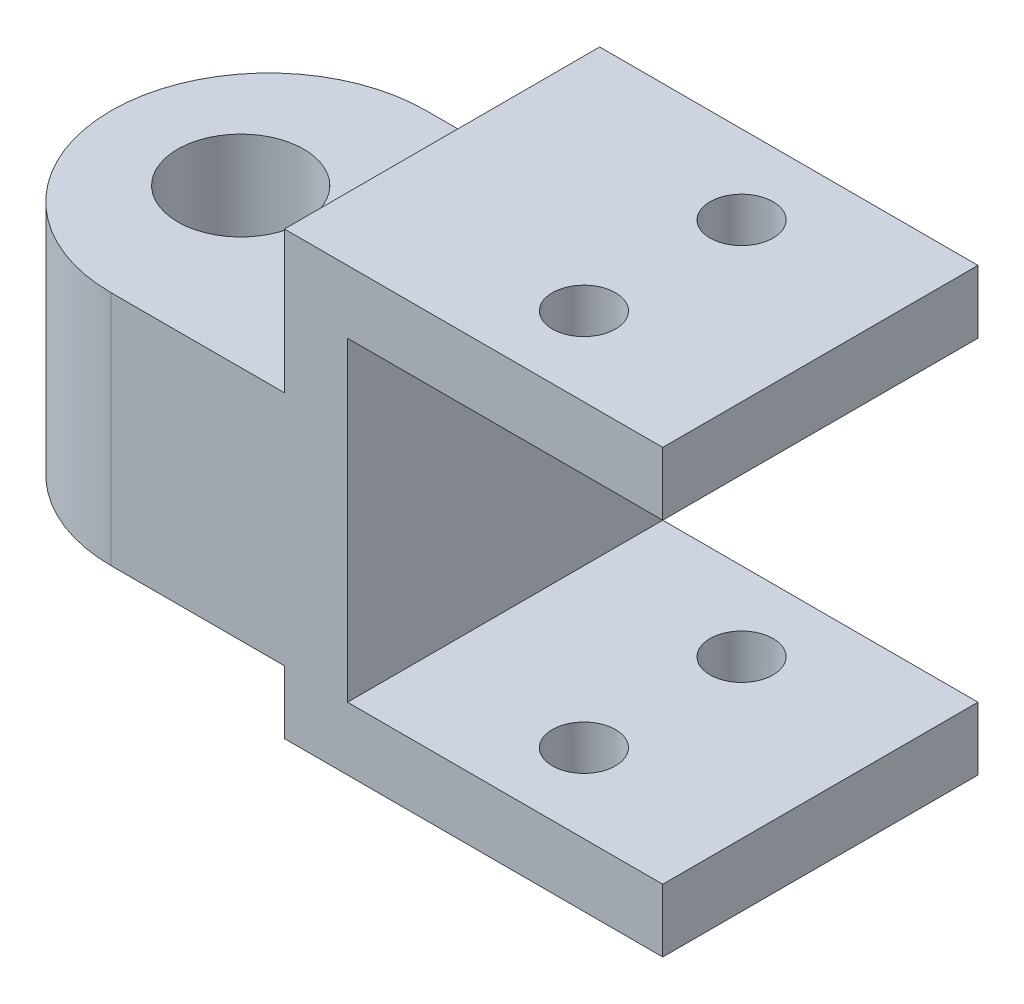
ISO-10303-21;
HEADER;
FILE_DESCRIPTION(('STEP AP214'),'2;1');
FILE_NAME('part.step','',(''),(''),'','','');
FILE_SCHEMA(('AUTOMOTIVE_DESIGN { 1 0 10303 214 1 1 1 1 }'));
ENDSEC;
DATA;
#1=APPLICATION_CONTEXT('core data for automotive mechanical design processes');
#2=APPLICATION_PROTOCOL_DEFINITION('international standard','automotive_design',2000,#1);
#3=PRODUCT_CONTEXT('',#1,'mechanical');
#4=PRODUCT('Part','Part','',(#3));
#5=PRODUCT_RELATED_PRODUCT_CATEGORY('part','',(#4));
#6=PRODUCT_DEFINITION_FORMATION('','',#4);
#7=PRODUCT_DEFINITION_CONTEXT('part definition',#1,'design');
#8=PRODUCT_DEFINITION('design','',#6,#7);
#9=PRODUCT_DEFINITION_SHAPE('','',#8);
#10=(LENGTH_UNIT() NAMED_UNIT(*) SI_UNIT(.MILLI.,.METRE.));
#11=(NAMED_UNIT(*) PLANE_ANGLE_UNIT() SI_UNIT($,.RADIAN.));
#12=(NAMED_UNIT(*) SI_UNIT($,.STERADIAN.) SOLID_ANGLE_UNIT());
#13=UNCERTAINTY_MEASURE_WITH_UNIT(LENGTH_MEASURE(1.E-05),#10,'distance_accuracy_value','');
#14=(GEOMETRIC_REPRESENTATION_CONTEXT(3) GLOBAL_UNCERTAINTY_ASSIGNED_CONTEXT((#13)) GLOBAL_UNIT_ASSIGNED_CONTEXT((#10,
#11,#12)) REPRESENTATION_CONTEXT('',''));
#15=CARTESIAN_POINT('',(0.,0.,0.));
#16=DIRECTION('',(0.,0.,1.));
#17=DIRECTION('',(1.,0.,0.));
#18=AXIS2_PLACEMENT_3D('',#15,#16,#17);
#19=CARTESIAN_POINT('',(-10.,0.,20.));
#20=DIRECTION('',(1.,0.,0.));
#21=DIRECTION('',(0.,0.,-1.));
#22=AXIS2_PLACEMENT_3D('',#19,#20,#21);
#23=PLANE('',#22);
#24=DIRECTION('',(0.,-1.,0.));
#25=VECTOR('',#24,1.);
#26=CARTESIAN_POINT('',(-10.,0.,0.));
#27=LINE('',#26,#25);
#28=CARTESIAN_POINT('',(-10.,10.,0.));
#29=VERTEX_POINT('',#28);
#30=CARTESIAN_POINT('',(-10.,-10.,0.));
#31=VERTEX_POINT('',#30);
#32=EDGE_CURVE('E131',#29,#31,#27,.T.);
#33=ORIENTED_EDGE('',*,*,#32,.F.);
#34=DIRECTION('',(0.,0.,-1.));
#35=VECTOR('',#34,1.);
#36=CARTESIAN_POINT('',(-10.,10.,20.));
#37=LINE('',#36,#35);
#38=CARTESIAN_POINT('',(-10.,10.,20.));
#39=VERTEX_POINT('',#38);
#40=EDGE_CURVE('E126',#39,#29,#37,.T.);
#41=ORIENTED_EDGE('',*,*,#40,.F.);
#42=DIRECTION('',(0.,-1.,0.));
#43=VECTOR('',#42,1.);
#44=CARTESIAN_POINT('',(-10.,0.,20.));
#45=LINE('',#44,#43);
#46=CARTESIAN_POINT('',(-10.,-10.,20.));
#47=VERTEX_POINT('',#46);
#48=EDGE_CURVE('E128',#39,#47,#45,.T.);
#49=ORIENTED_EDGE('',*,*,#48,.T.);
#50=DIRECTION('',(0.,0.,-1.));
#51=VECTOR('',#50,1.);
#52=CARTESIAN_POINT('',(-10.,-10.,20.));
#53=LINE('',#52,#51);
#54=EDGE_CURVE('E172',#47,#31,#53,.T.);
#55=ORIENTED_EDGE('',*,*,#54,.T.);
#56=EDGE_LOOP('',(#33,#41,#49,#55));
#57=FACE_BOUND('',#56,.T.);
#58=ADVANCED_FACE('F34',(#57),#23,.T.);
#59=CARTESIAN_POINT('',(0.,10.,20.));
#60=DIRECTION('',(0.,-1.,0.));
#61=DIRECTION('',(1.,0.,0.));
#62=AXIS2_PLACEMENT_3D('',#59,#60,#61);
#63=PLANE('',#62);
#64=CARTESIAN_POINT('',(0.,10.,5.));
#65=DIRECTION('',(0.,-1.,0.));
#66=DIRECTION('',(1.,0.,0.));
#67=AXIS2_PLACEMENT_3D('',#64,#65,#66);
#68=CIRCLE('',#67,2.);
#69=CARTESIAN_POINT('',(2.,10.,5.));
#70=VERTEX_POINT('',#69);
#71=EDGE_CURVE('E230',#70,#70,#68,.T.);
#72=ORIENTED_EDGE('',*,*,#71,.F.);
#73=EDGE_LOOP('',(#72));
#74=FACE_BOUND('',#73,.T.);
#75=CARTESIAN_POINT('',(0.,10.,15.));
#76=DIRECTION('',(0.,-1.,0.));
#77=DIRECTION('',(1.,0.,0.));
#78=AXIS2_PLACEMENT_3D('',#75,#76,#77);
#79=CIRCLE('',#78,2.);
#80=CARTESIAN_POINT('',(2.,10.,15.));
#81=VERTEX_POINT('',#80);
#82=EDGE_CURVE('E225',#81,#81,#79,.T.);
#83=ORIENTED_EDGE('',*,*,#82,.F.);
#84=EDGE_LOOP('',(#83));
#85=FACE_BOUND('',#84,.T.);
#86=DIRECTION('',(-1.,0.,0.));
#87=VECTOR('',#86,1.);
#88=CARTESIAN_POINT('',(0.,10.,0.));
#89=LINE('',#88,#87);
#90=CARTESIAN_POINT('',(10.,10.,0.));
#91=VERTEX_POINT('',#90);
#92=EDGE_CURVE('E174',#91,#29,#89,.T.);
#93=ORIENTED_EDGE('',*,*,#92,.F.);
#94=DIRECTION('',(0.,0.,-1.));
#95=VECTOR('',#94,1.);
#96=CARTESIAN_POINT('',(10.,10.,20.));
#97=LINE('',#96,#95);
#98=CARTESIAN_POINT('',(10.,10.,20.));
#99=VERTEX_POINT('',#98);
#100=EDGE_CURVE('E137',#99,#91,#97,.T.);
#101=ORIENTED_EDGE('',*,*,#100,.F.);
#102=DIRECTION('',(-1.,0.,0.));
#103=VECTOR('',#102,1.);
#104=CARTESIAN_POINT('',(0.,10.,20.));
#105=LINE('',#104,#103);
#106=EDGE_CURVE('E142',#99,#39,#105,.T.);
#107=ORIENTED_EDGE('',*,*,#106,.T.);
#108=ORIENTED_EDGE('',*,*,#40,.T.);
#109=EDGE_LOOP('',(#93,#101,#107,#108));
#110=FACE_BOUND('',#109,.T.);
#111=ADVANCED_FACE('F148',(#74,#85,#110),#63,.T.);
#112=CARTESIAN_POINT('',(10.,0.,20.));
#113=DIRECTION('',(-1.,0.,0.));
#114=DIRECTION('',(0.,0.,1.));
#115=AXIS2_PLACEMENT_3D('',#112,#113,#114);
#116=PLANE('',#115);
#117=DIRECTION('',(0.,1.,0.));
#118=VECTOR('',#117,1.);
#119=CARTESIAN_POINT('',(10.,0.,0.));
#120=LINE('',#119,#118);
#121=CARTESIAN_POINT('',(10.,14.,0.));
#122=VERTEX_POINT('',#121);
#123=EDGE_CURVE('E177',#91,#122,#120,.T.);
#124=ORIENTED_EDGE('',*,*,#123,.T.);
#125=DIRECTION('',(0.,0.,-1.));
#126=VECTOR('',#125,1.);
#127=CARTESIAN_POINT('',(10.,14.,20.));
#128=LINE('',#127,#126);
#129=CARTESIAN_POINT('',(10.,14.,20.));
#130=VERTEX_POINT('',#129);
#131=EDGE_CURVE('E215',#130,#122,#128,.T.);
#132=ORIENTED_EDGE('',*,*,#131,.F.);
#133=DIRECTION('',(0.,1.,0.));
#134=VECTOR('',#133,1.);
#135=CARTESIAN_POINT('',(10.,0.,20.));
#136=LINE('',#135,#134);
#137=EDGE_CURVE('E150',#99,#130,#136,.T.);
#138=ORIENTED_EDGE('',*,*,#137,.F.);
#139=ORIENTED_EDGE('',*,*,#100,.T.);
#140=EDGE_LOOP('',(#124,#132,#138,#139));
#141=FACE_BOUND('',#140,.T.);
#142=ADVANCED_FACE('F259',(#141),#116,.F.);
#143=CARTESIAN_POINT('',(0.,14.,20.));
#144=DIRECTION('',(0.,-1.,0.));
#145=DIRECTION('',(0.,0.,-1.));
#146=AXIS2_PLACEMENT_3D('',#143,#144,#145);
#147=PLANE('',#146);
#148=CARTESIAN_POINT('',(0.,14.,5.));
#149=DIRECTION('',(0.,1.,0.));
#150=DIRECTION('',(0.,0.,1.));
#151=AXIS2_PLACEMENT_3D('',#148,#149,#150);
#152=CIRCLE('',#151,2.);
#153=CARTESIAN_POINT('',(0.,14.,7.));
#154=VERTEX_POINT('',#153);
#155=EDGE_CURVE('E317',#154,#154,#152,.T.);
#156=ORIENTED_EDGE('',*,*,#155,.F.);
#157=EDGE_LOOP('',(#156));
#158=FACE_BOUND('',#157,.T.);
#159=CARTESIAN_POINT('',(0.,14.,15.));
#160=DIRECTION('',(0.,1.,0.));
#161=DIRECTION('',(0.,0.,1.));
#162=AXIS2_PLACEMENT_3D('',#159,#160,#161);
#163=CIRCLE('',#162,2.);
#164=CARTESIAN_POINT('',(0.,14.,17.));
#165=VERTEX_POINT('',#164);
#166=EDGE_CURVE('E310',#165,#165,#163,.T.);
#167=ORIENTED_EDGE('',*,*,#166,.F.);
#168=EDGE_LOOP('',(#167));
#169=FACE_BOUND('',#168,.T.);
#170=DIRECTION('',(-1.,0.,0.));
#171=VECTOR('',#170,1.);
#172=CARTESIAN_POINT('',(0.,14.,0.));
#173=LINE('',#172,#171);
#174=CARTESIAN_POINT('',(-14.,14.,0.));
#175=VERTEX_POINT('',#174);
#176=EDGE_CURVE('E179',#122,#175,#173,.T.);
#177=ORIENTED_EDGE('',*,*,#176,.T.);
#178=DIRECTION('',(0.,0.,-1.));
#179=VECTOR('',#178,1.);
#180=CARTESIAN_POINT('',(-14.,14.,20.));
#181=LINE('',#180,#179);
#182=CARTESIAN_POINT('',(-14.,14.,20.));
#183=VERTEX_POINT('',#182);
#184=EDGE_CURVE('E212',#183,#175,#181,.T.);
#185=ORIENTED_EDGE('',*,*,#184,.F.);
#186=DIRECTION('',(-1.,0.,0.));
#187=VECTOR('',#186,1.);
#188=CARTESIAN_POINT('',(0.,14.,20.));
#189=LINE('',#188,#187);
#190=EDGE_CURVE('E152',#130,#183,#189,.T.);
#191=ORIENTED_EDGE('',*,*,#190,.F.);
#192=ORIENTED_EDGE('',*,*,#131,.T.);
#193=EDGE_LOOP('',(#177,#185,#191,#192));
#194=FACE_BOUND('',#193,.T.);
#195=ADVANCED_FACE('F255',(#158,#169,#194),#147,.F.);
#196=CARTESIAN_POINT('',(-14.,0.,20.));
#197=DIRECTION('',(1.,0.,0.));
#198=DIRECTION('',(0.,0.,-1.));
#199=AXIS2_PLACEMENT_3D('',#196,#197,#198);
#200=PLANE('',#199);
#201=DIRECTION('',(0.,-1.,0.));
#202=VECTOR('',#201,1.);
#203=CARTESIAN_POINT('',(-14.,0.,0.));
#204=LINE('',#203,#202);
#205=CARTESIAN_POINT('',(-14.,5.,0.));
#206=VERTEX_POINT('',#205);
#207=EDGE_CURVE('E181',#175,#206,#204,.T.);
#208=ORIENTED_EDGE('',*,*,#207,.T.);
#209=DIRECTION('',(0.,0.,-1.));
#210=VECTOR('',#209,1.);
#211=CARTESIAN_POINT('',(-14.,5.,20.));
#212=LINE('',#211,#210);
#213=CARTESIAN_POINT('',(-14.,5.,20.));
#214=VERTEX_POINT('',#213);
#215=EDGE_CURVE('E209',#214,#206,#212,.T.);
#216=ORIENTED_EDGE('',*,*,#215,.F.);
#217=DIRECTION('',(0.,-1.,0.));
#218=VECTOR('',#217,1.);
#219=CARTESIAN_POINT('',(-14.,0.,20.));
#220=LINE('',#219,#218);
#221=EDGE_CURVE('E157',#183,#214,#220,.T.);
#222=ORIENTED_EDGE('',*,*,#221,.F.);
#223=ORIENTED_EDGE('',*,*,#184,.T.);
#224=EDGE_LOOP('',(#208,#216,#222,#223));
#225=FACE_BOUND('',#224,.T.);
#226=ADVANCED_FACE('F250',(#225),#200,.F.);
#227=CARTESIAN_POINT('',(0.,5.,20.));
#228=DIRECTION('',(0.,1.,0.));
#229=DIRECTION('',(0.,0.,1.));
#230=AXIS2_PLACEMENT_3D('',#227,#228,#229);
#231=PLANE('',#230);
#232=CARTESIAN_POINT('',(-26.775,5.,10.));
#233=DIRECTION('',(0.,1.,0.));
#234=DIRECTION('',(0.,0.,1.));
#235=AXIS2_PLACEMENT_3D('',#232,#233,#234);
#236=CIRCLE('',#235,4.);
#237=CARTESIAN_POINT('',(-26.775,5.,14.));
#238=VERTEX_POINT('',#237);
#239=EDGE_CURVE('E221',#238,#238,#236,.T.);
#240=ORIENTED_EDGE('',*,*,#239,.F.);
#241=EDGE_LOOP('',(#240));
#242=FACE_BOUND('',#241,.T.);
#243=DIRECTION('',(1.,0.,0.));
#244=VECTOR('',#243,1.);
#245=CARTESIAN_POINT('',(0.,5.,0.));
#246=LINE('',#245,#244);
#247=CARTESIAN_POINT('',(-25.,5.,0.));
#248=VERTEX_POINT('',#247);
#249=EDGE_CURVE('E184',#248,#206,#246,.T.);
#250=ORIENTED_EDGE('',*,*,#249,.F.);
#251=CARTESIAN_POINT('',(-25.,5.,10.));
#252=DIRECTION('',(0.,1.,0.));
#253=DIRECTION('',(0.,0.,1.));
#254=AXIS2_PLACEMENT_3D('',#251,#252,#253);
#255=CIRCLE('',#254,10.);
#256=CARTESIAN_POINT('',(-35.,5.,10.));
#257=VERTEX_POINT('',#256);
#258=EDGE_CURVE('E43',#248,#257,#255,.T.);
#259=ORIENTED_EDGE('',*,*,#258,.T.);
#260=CARTESIAN_POINT('',(-25.,5.,10.));
#261=DIRECTION('',(0.,1.,0.));
#262=DIRECTION('',(0.,0.,1.));
#263=AXIS2_PLACEMENT_3D('',#260,#261,#262);
#264=CIRCLE('',#263,10.);
#265=CARTESIAN_POINT('',(-25.,5.,20.));
#266=VERTEX_POINT('',#265);
#267=EDGE_CURVE('E50',#257,#266,#264,.T.);
#268=ORIENTED_EDGE('',*,*,#267,.T.);
#269=DIRECTION('',(1.,0.,0.));
#270=VECTOR('',#269,1.);
#271=CARTESIAN_POINT('',(0.,5.,20.));
#272=LINE('',#271,#270);
#273=EDGE_CURVE('E160',#266,#214,#272,.T.);
#274=ORIENTED_EDGE('',*,*,#273,.T.);
#275=ORIENTED_EDGE('',*,*,#215,.T.);
#276=EDGE_LOOP('',(#250,#259,#268,#274,#275));
#277=FACE_BOUND('',#276,.T.);
#278=ADVANCED_FACE('F246',(#242,#277),#231,.T.);
#279=CARTESIAN_POINT('',(0.,-10.,20.));
#280=DIRECTION('',(0.,1.,0.));
#281=DIRECTION('',(-1.,0.,0.));
#282=AXIS2_PLACEMENT_3D('',#279,#280,#281);
#283=PLANE('',#282);
#284=CARTESIAN_POINT('',(-26.775,-10.,10.));
#285=DIRECTION('',(0.,1.,0.));
#286=DIRECTION('',(-1.,0.,0.));
#287=AXIS2_PLACEMENT_3D('',#284,#285,#286);
#288=CIRCLE('',#287,4.);
#289=CARTESIAN_POINT('',(-30.775,-10.,10.));
#290=VERTEX_POINT('',#289);
#291=EDGE_CURVE('E175',#290,#290,#288,.T.);
#292=ORIENTED_EDGE('',*,*,#291,.T.);
#293=EDGE_LOOP('',(#292));
#294=FACE_BOUND('',#293,.T.);
#295=CARTESIAN_POINT('',(-25.,-10.,10.));
#296=DIRECTION('',(0.,1.,0.));
#297=DIRECTION('',(-1.,0.,0.));
#298=AXIS2_PLACEMENT_3D('',#295,#296,#297);
#299=CIRCLE('',#298,10.);
#300=CARTESIAN_POINT('',(-25.,-10.,20.));
#301=VERTEX_POINT('',#300);
#302=CARTESIAN_POINT('',(-35.,-10.,10.));
#303=VERTEX_POINT('',#302);
#304=EDGE_CURVE('E136',#301,#303,#299,.F.);
#305=ORIENTED_EDGE('',*,*,#304,.T.);
#306=CARTESIAN_POINT('',(-25.,-10.,10.));
#307=DIRECTION('',(0.,1.,0.));
#308=DIRECTION('',(-1.,0.,0.));
#309=AXIS2_PLACEMENT_3D('',#306,#307,#308);
#310=CIRCLE('',#309,10.);
#311=CARTESIAN_POINT('',(-25.,-10.,0.));
#312=VERTEX_POINT('',#311);
#313=EDGE_CURVE('E232',#303,#312,#310,.F.);
#314=ORIENTED_EDGE('',*,*,#313,.T.);
#315=DIRECTION('',(1.,0.,0.));
#316=VECTOR('',#315,1.);
#317=CARTESIAN_POINT('',(0.,-10.,0.));
#318=LINE('',#317,#316);
#319=CARTESIAN_POINT('',(-14.,-10.,0.));
#320=VERTEX_POINT('',#319);
#321=EDGE_CURVE('E186',#312,#320,#318,.T.);
#322=ORIENTED_EDGE('',*,*,#321,.T.);
#323=DIRECTION('',(0.,0.,-1.));
#324=VECTOR('',#323,1.);
#325=CARTESIAN_POINT('',(-14.,-10.,20.));
#326=LINE('',#325,#324);
#327=CARTESIAN_POINT('',(-14.,-10.,20.));
#328=VERTEX_POINT('',#327);
#329=EDGE_CURVE('E206',#328,#320,#326,.T.);
#330=ORIENTED_EDGE('',*,*,#329,.F.);
#331=DIRECTION('',(1.,0.,0.));
#332=VECTOR('',#331,1.);
#333=CARTESIAN_POINT('',(0.,-10.,20.));
#334=LINE('',#333,#332);
#335=EDGE_CURVE('E162',#301,#328,#334,.T.);
#336=ORIENTED_EDGE('',*,*,#335,.F.);
#337=EDGE_LOOP('',(#305,#314,#322,#330,#336));
#338=FACE_BOUND('',#337,.T.);
#339=ADVANCED_FACE('F267',(#294,#338),#283,.F.);
#340=CARTESIAN_POINT('',(-14.,0.,20.));
#341=DIRECTION('',(1.,0.,0.));
#342=DIRECTION('',(0.,0.,-1.));
#343=AXIS2_PLACEMENT_3D('',#340,#341,#342);
#344=PLANE('',#343);
#345=DIRECTION('',(0.,-1.,0.));
#346=VECTOR('',#345,1.);
#347=CARTESIAN_POINT('',(-14.,0.,0.));
#348=LINE('',#347,#346);
#349=CARTESIAN_POINT('',(-14.,-14.,0.));
#350=VERTEX_POINT('',#349);
#351=EDGE_CURVE('E188',#320,#350,#348,.T.);
#352=ORIENTED_EDGE('',*,*,#351,.T.);
#353=DIRECTION('',(0.,0.,-1.));
#354=VECTOR('',#353,1.);
#355=CARTESIAN_POINT('',(-14.,-14.,20.));
#356=LINE('',#355,#354);
#357=CARTESIAN_POINT('',(-14.,-14.,20.));
#358=VERTEX_POINT('',#357);
#359=EDGE_CURVE('E203',#358,#350,#356,.T.);
#360=ORIENTED_EDGE('',*,*,#359,.F.);
#361=DIRECTION('',(0.,-1.,0.));
#362=VECTOR('',#361,1.);
#363=CARTESIAN_POINT('',(-14.,0.,20.));
#364=LINE('',#363,#362);
#365=EDGE_CURVE('E164',#328,#358,#364,.T.);
#366=ORIENTED_EDGE('',*,*,#365,.F.);
#367=ORIENTED_EDGE('',*,*,#329,.T.);
#368=EDGE_LOOP('',(#352,#360,#366,#367));
#369=FACE_BOUND('',#368,.T.);
#370=ADVANCED_FACE('F274',(#369),#344,.F.);
#371=CARTESIAN_POINT('',(0.,-14.,20.));
#372=DIRECTION('',(0.,1.,0.));
#373=DIRECTION('',(0.,0.,1.));
#374=AXIS2_PLACEMENT_3D('',#371,#372,#373);
#375=PLANE('',#374);
#376=CARTESIAN_POINT('',(0.,-14.,5.));
#377=DIRECTION('',(0.,1.,0.));
#378=DIRECTION('',(0.,0.,1.));
#379=AXIS2_PLACEMENT_3D('',#376,#377,#378);
#380=CIRCLE('',#379,2.);
#381=CARTESIAN_POINT('',(0.,-14.,7.));
#382=VERTEX_POINT('',#381);
#383=EDGE_CURVE('E226',#382,#382,#380,.T.);
#384=ORIENTED_EDGE('',*,*,#383,.T.);
#385=EDGE_LOOP('',(#384));
#386=FACE_BOUND('',#385,.T.);
#387=CARTESIAN_POINT('',(0.,-14.,15.));
#388=DIRECTION('',(0.,1.,0.));
#389=DIRECTION('',(0.,0.,1.));
#390=AXIS2_PLACEMENT_3D('',#387,#388,#389);
#391=CIRCLE('',#390,2.);
#392=CARTESIAN_POINT('',(0.,-14.,17.));
#393=VERTEX_POINT('',#392);
#394=EDGE_CURVE('E312',#393,#393,#391,.T.);
#395=ORIENTED_EDGE('',*,*,#394,.T.);
#396=EDGE_LOOP('',(#395));
#397=FACE_BOUND('',#396,.T.);
#398=DIRECTION('',(1.,0.,0.));
#399=VECTOR('',#398,1.);
#400=CARTESIAN_POINT('',(0.,-14.,0.));
#401=LINE('',#400,#399);
#402=CARTESIAN_POINT('',(10.,-14.,0.));
#403=VERTEX_POINT('',#402);
#404=EDGE_CURVE('E190',#350,#403,#401,.T.);
#405=ORIENTED_EDGE('',*,*,#404,.T.);
#406=DIRECTION('',(0.,0.,-1.));
#407=VECTOR('',#406,1.);
#408=CARTESIAN_POINT('',(10.,-14.,20.));
#409=LINE('',#408,#407);
#410=CARTESIAN_POINT('',(10.,-14.,20.));
#411=VERTEX_POINT('',#410);
#412=EDGE_CURVE('E201',#411,#403,#409,.T.);
#413=ORIENTED_EDGE('',*,*,#412,.F.);
#414=DIRECTION('',(1.,0.,0.));
#415=VECTOR('',#414,1.);
#416=CARTESIAN_POINT('',(0.,-14.,20.));
#417=LINE('',#416,#415);
#418=EDGE_CURVE('E166',#358,#411,#417,.T.);
#419=ORIENTED_EDGE('',*,*,#418,.F.);
#420=ORIENTED_EDGE('',*,*,#359,.T.);
#421=EDGE_LOOP('',(#405,#413,#419,#420));
#422=FACE_BOUND('',#421,.T.);
#423=ADVANCED_FACE('F277',(#386,#397,#422),#375,.F.);
#424=CARTESIAN_POINT('',(10.,0.,20.));
#425=DIRECTION('',(1.,0.,0.));
#426=DIRECTION('',(0.,0.,-1.));
#427=AXIS2_PLACEMENT_3D('',#424,#425,#426);
#428=PLANE('',#427);
#429=DIRECTION('',(0.,-1.,0.));
#430=VECTOR('',#429,1.);
#431=CARTESIAN_POINT('',(10.,0.,0.));
#432=LINE('',#431,#430);
#433=CARTESIAN_POINT('',(10.,-10.,0.));
#434=VERTEX_POINT('',#433);
#435=EDGE_CURVE('E193',#434,#403,#432,.T.);
#436=ORIENTED_EDGE('',*,*,#435,.F.);
#437=DIRECTION('',(0.,0.,-1.));
#438=VECTOR('',#437,1.);
#439=CARTESIAN_POINT('',(10.,-10.,20.));
#440=LINE('',#439,#438);
#441=CARTESIAN_POINT('',(10.,-10.,20.));
#442=VERTEX_POINT('',#441);
#443=EDGE_CURVE('E199',#442,#434,#440,.T.);
#444=ORIENTED_EDGE('',*,*,#443,.F.);
#445=DIRECTION('',(0.,-1.,0.));
#446=VECTOR('',#445,1.);
#447=CARTESIAN_POINT('',(10.,0.,20.));
#448=LINE('',#447,#446);
#449=EDGE_CURVE('E168',#442,#411,#448,.T.);
#450=ORIENTED_EDGE('',*,*,#449,.T.);
#451=ORIENTED_EDGE('',*,*,#412,.T.);
#452=EDGE_LOOP('',(#436,#444,#450,#451));
#453=FACE_BOUND('',#452,.T.);
#454=ADVANCED_FACE('F280',(#453),#428,.T.);
#455=CARTESIAN_POINT('',(0.,-10.,20.));
#456=DIRECTION('',(0.,1.,0.));
#457=DIRECTION('',(-1.,0.,0.));
#458=AXIS2_PLACEMENT_3D('',#455,#456,#457);
#459=PLANE('',#458);
#460=CARTESIAN_POINT('',(0.,-10.,5.));
#461=DIRECTION('',(0.,1.,0.));
#462=DIRECTION('',(-1.,0.,0.));
#463=AXIS2_PLACEMENT_3D('',#460,#461,#462);
#464=CIRCLE('',#463,2.);
#465=CARTESIAN_POINT('',(-2.,-10.,5.));
#466=VERTEX_POINT('',#465);
#467=EDGE_CURVE('E227',#466,#466,#464,.T.);
#468=ORIENTED_EDGE('',*,*,#467,.F.);
#469=EDGE_LOOP('',(#468));
#470=FACE_BOUND('',#469,.T.);
#471=CARTESIAN_POINT('',(0.,-10.,15.));
#472=DIRECTION('',(0.,1.,0.));
#473=DIRECTION('',(-1.,0.,0.));
#474=AXIS2_PLACEMENT_3D('',#471,#472,#473);
#475=CIRCLE('',#474,2.);
#476=CARTESIAN_POINT('',(-2.,-10.,15.));
#477=VERTEX_POINT('',#476);
#478=EDGE_CURVE('E222',#477,#477,#475,.T.);
#479=ORIENTED_EDGE('',*,*,#478,.F.);
#480=EDGE_LOOP('',(#479));
#481=FACE_BOUND('',#480,.T.);
#482=DIRECTION('',(1.,0.,0.));
#483=VECTOR('',#482,1.);
#484=CARTESIAN_POINT('',(0.,-10.,0.));
#485=LINE('',#484,#483);
#486=EDGE_CURVE('E146',#31,#434,#485,.T.);
#487=ORIENTED_EDGE('',*,*,#486,.F.);
#488=ORIENTED_EDGE('',*,*,#54,.F.);
#489=DIRECTION('',(1.,0.,0.));
#490=VECTOR('',#489,1.);
#491=CARTESIAN_POINT('',(0.,-10.,20.));
#492=LINE('',#491,#490);
#493=EDGE_CURVE('E145',#47,#442,#492,.T.);
#494=ORIENTED_EDGE('',*,*,#493,.T.);
#495=ORIENTED_EDGE('',*,*,#443,.T.);
#496=EDGE_LOOP('',(#487,#488,#494,#495));
#497=FACE_BOUND('',#496,.T.);
#498=ADVANCED_FACE('F283',(#470,#481,#497),#459,.T.);
#499=CARTESIAN_POINT('',(0.,0.,20.));
#500=DIRECTION('',(0.,0.,1.));
#501=DIRECTION('',(1.,0.,0.));
#502=AXIS2_PLACEMENT_3D('',#499,#500,#501);
#503=PLANE('',#502);
#504=ORIENTED_EDGE('',*,*,#273,.F.);
#505=DIRECTION('',(0.,-1.,0.));
#506=VECTOR('',#505,1.);
#507=CARTESIAN_POINT('',(-25.,-10.,20.));
#508=LINE('',#507,#506);
#509=EDGE_CURVE('E11',#266,#301,#508,.T.);
#510=ORIENTED_EDGE('',*,*,#509,.T.);
#511=ORIENTED_EDGE('',*,*,#335,.T.);
#512=ORIENTED_EDGE('',*,*,#365,.T.);
#513=ORIENTED_EDGE('',*,*,#418,.T.);
#514=ORIENTED_EDGE('',*,*,#449,.F.);
#515=ORIENTED_EDGE('',*,*,#493,.F.);
#516=ORIENTED_EDGE('',*,*,#48,.F.);
#517=ORIENTED_EDGE('',*,*,#106,.F.);
#518=ORIENTED_EDGE('',*,*,#137,.T.);
#519=ORIENTED_EDGE('',*,*,#190,.T.);
#520=ORIENTED_EDGE('',*,*,#221,.T.);
#521=EDGE_LOOP('',(#504,#510,#511,#512,#513,#514,#515,#516,#517,#518,#519,#520));
#522=FACE_BOUND('',#521,.T.);
#523=ADVANCED_FACE('F141',(#522),#503,.T.);
#524=CARTESIAN_POINT('',(0.,0.,0.));
#525=DIRECTION('',(0.,0.,1.));
#526=DIRECTION('',(1.,0.,0.));
#527=AXIS2_PLACEMENT_3D('',#524,#525,#526);
#528=PLANE('',#527);
#529=ORIENTED_EDGE('',*,*,#321,.F.);
#530=DIRECTION('',(0.,-1.,0.));
#531=VECTOR('',#530,1.);
#532=CARTESIAN_POINT('',(-25.,0.,0.));
#533=LINE('',#532,#531);
#534=EDGE_CURVE('E234',#312,#248,#533,.F.);
#535=ORIENTED_EDGE('',*,*,#534,.T.);
#536=ORIENTED_EDGE('',*,*,#249,.T.);
#537=ORIENTED_EDGE('',*,*,#207,.F.);
#538=ORIENTED_EDGE('',*,*,#176,.F.);
#539=ORIENTED_EDGE('',*,*,#123,.F.);
#540=ORIENTED_EDGE('',*,*,#92,.T.);
#541=ORIENTED_EDGE('',*,*,#32,.T.);
#542=ORIENTED_EDGE('',*,*,#486,.T.);
#543=ORIENTED_EDGE('',*,*,#435,.T.);
#544=ORIENTED_EDGE('',*,*,#404,.F.);
#545=ORIENTED_EDGE('',*,*,#351,.F.);
#546=EDGE_LOOP('',(#529,#535,#536,#537,#538,#539,#540,#541,#542,#543,#544,#545));
#547=FACE_BOUND('',#546,.T.);
#548=ADVANCED_FACE('F241',(#547),#528,.F.);
#549=CARTESIAN_POINT('',(-26.775,-14.,10.));
#550=DIRECTION('',(0.,1.,0.));
#551=DIRECTION('',(0.,0.,1.));
#552=AXIS2_PLACEMENT_3D('',#549,#550,#551);
#553=CYLINDRICAL_SURFACE('',#552,4.);
#554=ORIENTED_EDGE('',*,*,#239,.T.);
#555=EDGE_LOOP('',(#554));
#556=FACE_BOUND('',#555,.T.);
#557=ORIENTED_EDGE('',*,*,#291,.F.);
#558=EDGE_LOOP('',(#557));
#559=FACE_BOUND('',#558,.T.);
#560=ADVANCED_FACE('F328',(#556,#559),#553,.F.);
#561=CARTESIAN_POINT('',(0.,-14.,15.));
#562=DIRECTION('',(0.,1.,0.));
#563=DIRECTION('',(0.,0.,1.));
#564=AXIS2_PLACEMENT_3D('',#561,#562,#563);
#565=CYLINDRICAL_SURFACE('',#564,2.);
#566=ORIENTED_EDGE('',*,*,#478,.T.);
#567=EDGE_LOOP('',(#566));
#568=FACE_BOUND('',#567,.T.);
#569=ORIENTED_EDGE('',*,*,#394,.F.);
#570=EDGE_LOOP('',(#569));
#571=FACE_BOUND('',#570,.T.);
#572=ADVANCED_FACE('F384',(#568,#571),#565,.F.);
#573=CARTESIAN_POINT('',(0.,-14.,5.));
#574=DIRECTION('',(0.,1.,0.));
#575=DIRECTION('',(0.,0.,1.));
#576=AXIS2_PLACEMENT_3D('',#573,#574,#575);
#577=CYLINDRICAL_SURFACE('',#576,2.);
#578=ORIENTED_EDGE('',*,*,#467,.T.);
#579=EDGE_LOOP('',(#578));
#580=FACE_BOUND('',#579,.T.);
#581=ORIENTED_EDGE('',*,*,#383,.F.);
#582=EDGE_LOOP('',(#581));
#583=FACE_BOUND('',#582,.T.);
#584=ADVANCED_FACE('F419',(#580,#583),#577,.F.);
#585=ORIENTED_EDGE('',*,*,#82,.T.);
#586=EDGE_LOOP('',(#585));
#587=FACE_BOUND('',#586,.T.);
#588=ORIENTED_EDGE('',*,*,#166,.T.);
#589=EDGE_LOOP('',(#588));
#590=FACE_BOUND('',#589,.T.);
#591=ADVANCED_FACE('F422',(#587,#590),#565,.F.);
#592=ORIENTED_EDGE('',*,*,#71,.T.);
#593=EDGE_LOOP('',(#592));
#594=FACE_BOUND('',#593,.T.);
#595=ORIENTED_EDGE('',*,*,#155,.T.);
#596=EDGE_LOOP('',(#595));
#597=FACE_BOUND('',#596,.T.);
#598=ADVANCED_FACE('F309',(#594,#597),#577,.F.);
#599=CARTESIAN_POINT('',(-25.,0.,10.));
#600=DIRECTION('',(0.,1.,0.));
#601=DIRECTION('',(0.,0.,1.));
#602=AXIS2_PLACEMENT_3D('',#599,#600,#601);
#603=CYLINDRICAL_SURFACE('',#602,10.);
#604=ORIENTED_EDGE('',*,*,#509,.F.);
#605=ORIENTED_EDGE('',*,*,#267,.F.);
#606=DIRECTION('',(0.,-1.,0.));
#607=VECTOR('',#606,1.);
#608=CARTESIAN_POINT('',(-35.,5.,10.));
#609=LINE('',#608,#607);
#610=EDGE_CURVE('E38',#303,#257,#609,.F.);
#611=ORIENTED_EDGE('',*,*,#610,.F.);
#612=ORIENTED_EDGE('',*,*,#304,.F.);
#613=EDGE_LOOP('',(#604,#605,#611,#612));
#614=FACE_BOUND('',#613,.T.);
#615=ADVANCED_FACE('F36',(#614),#603,.T.);
#616=CARTESIAN_POINT('',(-25.,0.,10.));
#617=DIRECTION('',(0.,-1.,0.));
#618=DIRECTION('',(0.,0.,-1.));
#619=AXIS2_PLACEMENT_3D('',#616,#617,#618);
#620=CYLINDRICAL_SURFACE('',#619,10.);
#621=ORIENTED_EDGE('',*,*,#258,.F.);
#622=ORIENTED_EDGE('',*,*,#534,.F.);
#623=ORIENTED_EDGE('',*,*,#313,.F.);
#624=ORIENTED_EDGE('',*,*,#610,.T.);
#625=EDGE_LOOP('',(#621,#622,#623,#624));
#626=FACE_BOUND('',#625,.T.);
#627=ADVANCED_FACE('F304',(#626),#620,.T.);
#628=CLOSED_SHELL('',(#58,#111,#142,#195,#226,#278,#339,#370,#423,#454,#498,#523,#548,#560,#572,
#584,#591,#598,#615,#627));
#629=MANIFOLD_SOLID_BREP('B2',#628);
#630=ADVANCED_BREP_SHAPE_REPRESENTATION('',(#18,#629),#14);
#631=SHAPE_DEFINITION_REPRESENTATION(#9,#630);
ENDSEC;
END-ISO-10303-21;
